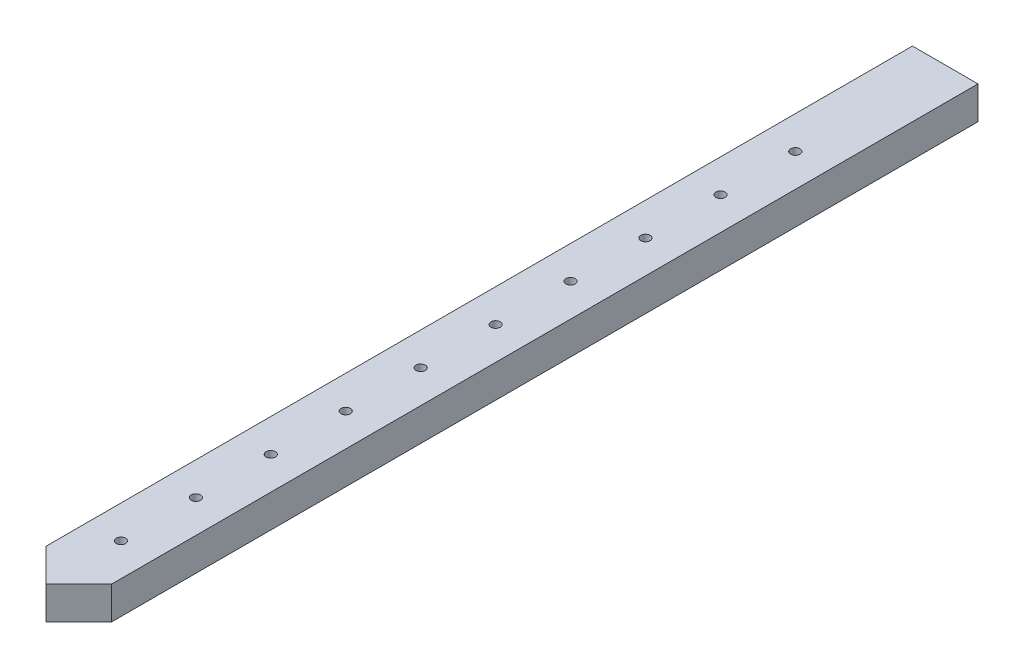
ISO-10303-21;
HEADER;
FILE_DESCRIPTION(('STEP AP214'),'2;1');
FILE_NAME('part.step','',(''),(''),'','','');
FILE_SCHEMA(('AUTOMOTIVE_DESIGN { 1 0 10303 214 1 1 1 1 }'));
ENDSEC;
DATA;
#1=APPLICATION_CONTEXT('core data for automotive mechanical design processes');
#2=APPLICATION_PROTOCOL_DEFINITION('international standard','automotive_design',2000,#1);
#3=PRODUCT_CONTEXT('',#1,'mechanical');
#4=PRODUCT('Part','Part','',(#3));
#5=PRODUCT_RELATED_PRODUCT_CATEGORY('part','',(#4));
#6=PRODUCT_DEFINITION_FORMATION('','',#4);
#7=PRODUCT_DEFINITION_CONTEXT('part definition',#1,'design');
#8=PRODUCT_DEFINITION('design','',#6,#7);
#9=PRODUCT_DEFINITION_SHAPE('','',#8);
#10=(LENGTH_UNIT() NAMED_UNIT(*) SI_UNIT(.MILLI.,.METRE.));
#11=(NAMED_UNIT(*) PLANE_ANGLE_UNIT() SI_UNIT($,.RADIAN.));
#12=(NAMED_UNIT(*) SI_UNIT($,.STERADIAN.) SOLID_ANGLE_UNIT());
#13=UNCERTAINTY_MEASURE_WITH_UNIT(LENGTH_MEASURE(1.E-05),#10,'distance_accuracy_value','');
#14=(GEOMETRIC_REPRESENTATION_CONTEXT(3) GLOBAL_UNCERTAINTY_ASSIGNED_CONTEXT((#13)) GLOBAL_UNIT_ASSIGNED_CONTEXT((#10,
#11,#12)) REPRESENTATION_CONTEXT('',''));
#15=CARTESIAN_POINT('',(0.,0.,0.));
#16=DIRECTION('',(0.,0.,1.));
#17=DIRECTION('',(1.,0.,0.));
#18=AXIS2_PLACEMENT_3D('',#15,#16,#17);
#19=CARTESIAN_POINT('',(0.,0.,203.200000000001));
#20=DIRECTION('',(0.,1.,0.));
#21=DIRECTION('',(0.,0.,1.));
#22=AXIS2_PLACEMENT_3D('',#19,#20,#21);
#23=PLANE('',#22);
#24=CARTESIAN_POINT('',(0.,0.,203.200000000001));
#25=DIRECTION('',(0.,1.,0.));
#26=DIRECTION('',(0.,0.,1.));
#27=AXIS2_PLACEMENT_3D('',#24,#25,#26);
#28=CIRCLE('',#27,6.35);
#29=CARTESIAN_POINT('',(0.,0.,209.55));
#30=VERTEX_POINT('',#29);
#31=EDGE_CURVE('E12',#30,#30,#28,.T.);
#32=ORIENTED_EDGE('',*,*,#31,.T.);
#33=EDGE_LOOP('',(#32));
#34=FACE_BOUND('',#33,.T.);
#35=ADVANCED_FACE('F50',(#34),#23,.T.);
#36=CARTESIAN_POINT('',(0.,0.,203.200000000001));
#37=DIRECTION('',(0.,1.,0.));
#38=DIRECTION('',(0.,0.,1.));
#39=AXIS2_PLACEMENT_3D('',#36,#37,#38);
#40=CYLINDRICAL_SURFACE('',#39,6.35);
#41=ORIENTED_EDGE('',*,*,#31,.F.);
#42=EDGE_LOOP('',(#41));
#43=FACE_BOUND('',#42,.T.);
#44=CARTESIAN_POINT('',(0.,22.225,203.200000000001));
#45=DIRECTION('',(0.,1.,0.));
#46=DIRECTION('',(0.,0.,1.));
#47=AXIS2_PLACEMENT_3D('',#44,#45,#46);
#48=CIRCLE('',#47,6.35);
#49=CARTESIAN_POINT('',(0.,22.225,209.55));
#50=VERTEX_POINT('',#49);
#51=EDGE_CURVE('E57',#50,#50,#48,.T.);
#52=ORIENTED_EDGE('',*,*,#51,.T.);
#53=EDGE_LOOP('',(#52));
#54=FACE_BOUND('',#53,.T.);
#55=ADVANCED_FACE('F181',(#43,#54),#40,.F.);
#56=CARTESIAN_POINT('',(0.,0.,304.800000000001));
#57=DIRECTION('',(0.,1.,0.));
#58=DIRECTION('',(0.,0.,1.));
#59=AXIS2_PLACEMENT_3D('',#56,#57,#58);
#60=PLANE('',#59);
#61=CARTESIAN_POINT('',(0.,0.,304.800000000001));
#62=DIRECTION('',(0.,1.,0.));
#63=DIRECTION('',(0.,0.,1.));
#64=AXIS2_PLACEMENT_3D('',#61,#62,#63);
#65=CIRCLE('',#64,6.35);
#66=CARTESIAN_POINT('',(0.,0.,311.150000000001));
#67=VERTEX_POINT('',#66);
#68=EDGE_CURVE('E176',#67,#67,#65,.T.);
#69=ORIENTED_EDGE('',*,*,#68,.T.);
#70=EDGE_LOOP('',(#69));
#71=FACE_BOUND('',#70,.T.);
#72=ADVANCED_FACE('F204',(#71),#60,.T.);
#73=CARTESIAN_POINT('',(0.,0.,304.800000000001));
#74=DIRECTION('',(0.,1.,0.));
#75=DIRECTION('',(0.,0.,1.));
#76=AXIS2_PLACEMENT_3D('',#73,#74,#75);
#77=CYLINDRICAL_SURFACE('',#76,6.35);
#78=ORIENTED_EDGE('',*,*,#68,.F.);
#79=EDGE_LOOP('',(#78));
#80=FACE_BOUND('',#79,.T.);
#81=CARTESIAN_POINT('',(0.,22.225,304.800000000001));
#82=DIRECTION('',(0.,1.,0.));
#83=DIRECTION('',(0.,0.,1.));
#84=AXIS2_PLACEMENT_3D('',#81,#82,#83);
#85=CIRCLE('',#84,6.35);
#86=CARTESIAN_POINT('',(0.,22.225,311.150000000001));
#87=VERTEX_POINT('',#86);
#88=EDGE_CURVE('E173',#87,#87,#85,.T.);
#89=ORIENTED_EDGE('',*,*,#88,.T.);
#90=EDGE_LOOP('',(#89));
#91=FACE_BOUND('',#90,.T.);
#92=ADVANCED_FACE('F210',(#80,#91),#77,.F.);
#93=CARTESIAN_POINT('',(0.,0.,406.400000000001));
#94=DIRECTION('',(0.,1.,0.));
#95=DIRECTION('',(0.,0.,1.));
#96=AXIS2_PLACEMENT_3D('',#93,#94,#95);
#97=PLANE('',#96);
#98=CARTESIAN_POINT('',(0.,0.,406.400000000001));
#99=DIRECTION('',(0.,1.,0.));
#100=DIRECTION('',(0.,0.,1.));
#101=AXIS2_PLACEMENT_3D('',#98,#99,#100);
#102=CIRCLE('',#101,6.35);
#103=CARTESIAN_POINT('',(0.,0.,412.750000000001));
#104=VERTEX_POINT('',#103);
#105=EDGE_CURVE('E170',#104,#104,#102,.T.);
#106=ORIENTED_EDGE('',*,*,#105,.T.);
#107=EDGE_LOOP('',(#106));
#108=FACE_BOUND('',#107,.T.);
#109=ADVANCED_FACE('F216',(#108),#97,.T.);
#110=CARTESIAN_POINT('',(0.,0.,406.400000000001));
#111=DIRECTION('',(0.,1.,0.));
#112=DIRECTION('',(0.,0.,1.));
#113=AXIS2_PLACEMENT_3D('',#110,#111,#112);
#114=CYLINDRICAL_SURFACE('',#113,6.35);
#115=ORIENTED_EDGE('',*,*,#105,.F.);
#116=EDGE_LOOP('',(#115));
#117=FACE_BOUND('',#116,.T.);
#118=CARTESIAN_POINT('',(0.,22.225,406.400000000001));
#119=DIRECTION('',(0.,1.,0.));
#120=DIRECTION('',(0.,0.,1.));
#121=AXIS2_PLACEMENT_3D('',#118,#119,#120);
#122=CIRCLE('',#121,6.35);
#123=CARTESIAN_POINT('',(0.,22.225,412.750000000001));
#124=VERTEX_POINT('',#123);
#125=EDGE_CURVE('E167',#124,#124,#122,.T.);
#126=ORIENTED_EDGE('',*,*,#125,.T.);
#127=EDGE_LOOP('',(#126));
#128=FACE_BOUND('',#127,.T.);
#129=ADVANCED_FACE('F220',(#117,#128),#114,.F.);
#130=CARTESIAN_POINT('',(0.,0.,508.000000000001));
#131=DIRECTION('',(0.,1.,0.));
#132=DIRECTION('',(0.,0.,1.));
#133=AXIS2_PLACEMENT_3D('',#130,#131,#132);
#134=PLANE('',#133);
#135=CARTESIAN_POINT('',(0.,0.,508.000000000001));
#136=DIRECTION('',(0.,1.,0.));
#137=DIRECTION('',(0.,0.,1.));
#138=AXIS2_PLACEMENT_3D('',#135,#136,#137);
#139=CIRCLE('',#138,6.35);
#140=CARTESIAN_POINT('',(0.,0.,514.35));
#141=VERTEX_POINT('',#140);
#142=EDGE_CURVE('E164',#141,#141,#139,.T.);
#143=ORIENTED_EDGE('',*,*,#142,.T.);
#144=EDGE_LOOP('',(#143));
#145=FACE_BOUND('',#144,.T.);
#146=ADVANCED_FACE('F224',(#145),#134,.T.);
#147=CARTESIAN_POINT('',(0.,0.,508.000000000001));
#148=DIRECTION('',(0.,1.,0.));
#149=DIRECTION('',(0.,0.,1.));
#150=AXIS2_PLACEMENT_3D('',#147,#148,#149);
#151=CYLINDRICAL_SURFACE('',#150,6.35);
#152=ORIENTED_EDGE('',*,*,#142,.F.);
#153=EDGE_LOOP('',(#152));
#154=FACE_BOUND('',#153,.T.);
#155=CARTESIAN_POINT('',(0.,22.225,508.000000000001));
#156=DIRECTION('',(0.,1.,0.));
#157=DIRECTION('',(0.,0.,1.));
#158=AXIS2_PLACEMENT_3D('',#155,#156,#157);
#159=CIRCLE('',#158,6.35);
#160=CARTESIAN_POINT('',(0.,22.225,514.35));
#161=VERTEX_POINT('',#160);
#162=EDGE_CURVE('E161',#161,#161,#159,.T.);
#163=ORIENTED_EDGE('',*,*,#162,.T.);
#164=EDGE_LOOP('',(#163));
#165=FACE_BOUND('',#164,.T.);
#166=ADVANCED_FACE('F228',(#154,#165),#151,.F.);
#167=CARTESIAN_POINT('',(0.,0.,609.6));
#168=DIRECTION('',(0.,1.,0.));
#169=DIRECTION('',(0.,0.,1.));
#170=AXIS2_PLACEMENT_3D('',#167,#168,#169);
#171=PLANE('',#170);
#172=CARTESIAN_POINT('',(0.,0.,609.6));
#173=DIRECTION('',(0.,1.,0.));
#174=DIRECTION('',(0.,0.,1.));
#175=AXIS2_PLACEMENT_3D('',#172,#173,#174);
#176=CIRCLE('',#175,6.35);
#177=CARTESIAN_POINT('',(0.,0.,615.95));
#178=VERTEX_POINT('',#177);
#179=EDGE_CURVE('E158',#178,#178,#176,.T.);
#180=ORIENTED_EDGE('',*,*,#179,.T.);
#181=EDGE_LOOP('',(#180));
#182=FACE_BOUND('',#181,.T.);
#183=ADVANCED_FACE('F232',(#182),#171,.T.);
#184=CARTESIAN_POINT('',(0.,0.,609.6));
#185=DIRECTION('',(0.,1.,0.));
#186=DIRECTION('',(0.,0.,1.));
#187=AXIS2_PLACEMENT_3D('',#184,#185,#186);
#188=CYLINDRICAL_SURFACE('',#187,6.35);
#189=ORIENTED_EDGE('',*,*,#179,.F.);
#190=EDGE_LOOP('',(#189));
#191=FACE_BOUND('',#190,.T.);
#192=CARTESIAN_POINT('',(0.,22.225,609.6));
#193=DIRECTION('',(0.,1.,0.));
#194=DIRECTION('',(0.,0.,1.));
#195=AXIS2_PLACEMENT_3D('',#192,#193,#194);
#196=CIRCLE('',#195,6.35);
#197=CARTESIAN_POINT('',(0.,22.225,615.95));
#198=VERTEX_POINT('',#197);
#199=EDGE_CURVE('E155',#198,#198,#196,.T.);
#200=ORIENTED_EDGE('',*,*,#199,.T.);
#201=EDGE_LOOP('',(#200));
#202=FACE_BOUND('',#201,.T.);
#203=ADVANCED_FACE('F236',(#191,#202),#188,.F.);
#204=CARTESIAN_POINT('',(0.,0.,711.200000000001));
#205=DIRECTION('',(0.,1.,0.));
#206=DIRECTION('',(0.,0.,1.));
#207=AXIS2_PLACEMENT_3D('',#204,#205,#206);
#208=PLANE('',#207);
#209=CARTESIAN_POINT('',(0.,0.,711.200000000001));
#210=DIRECTION('',(0.,1.,0.));
#211=DIRECTION('',(0.,0.,1.));
#212=AXIS2_PLACEMENT_3D('',#209,#210,#211);
#213=CIRCLE('',#212,6.35);
#214=CARTESIAN_POINT('',(0.,0.,717.55));
#215=VERTEX_POINT('',#214);
#216=EDGE_CURVE('E152',#215,#215,#213,.T.);
#217=ORIENTED_EDGE('',*,*,#216,.T.);
#218=EDGE_LOOP('',(#217));
#219=FACE_BOUND('',#218,.T.);
#220=ADVANCED_FACE('F240',(#219),#208,.T.);
#221=CARTESIAN_POINT('',(0.,0.,711.200000000001));
#222=DIRECTION('',(0.,1.,0.));
#223=DIRECTION('',(0.,0.,1.));
#224=AXIS2_PLACEMENT_3D('',#221,#222,#223);
#225=CYLINDRICAL_SURFACE('',#224,6.35);
#226=ORIENTED_EDGE('',*,*,#216,.F.);
#227=EDGE_LOOP('',(#226));
#228=FACE_BOUND('',#227,.T.);
#229=CARTESIAN_POINT('',(0.,22.225,711.200000000001));
#230=DIRECTION('',(0.,1.,0.));
#231=DIRECTION('',(0.,0.,1.));
#232=AXIS2_PLACEMENT_3D('',#229,#230,#231);
#233=CIRCLE('',#232,6.35);
#234=CARTESIAN_POINT('',(0.,22.225,717.55));
#235=VERTEX_POINT('',#234);
#236=EDGE_CURVE('E149',#235,#235,#233,.T.);
#237=ORIENTED_EDGE('',*,*,#236,.T.);
#238=EDGE_LOOP('',(#237));
#239=FACE_BOUND('',#238,.T.);
#240=ADVANCED_FACE('F244',(#228,#239),#225,.F.);
#241=CARTESIAN_POINT('',(0.,0.,812.800000000001));
#242=DIRECTION('',(0.,1.,0.));
#243=DIRECTION('',(0.,0.,1.));
#244=AXIS2_PLACEMENT_3D('',#241,#242,#243);
#245=PLANE('',#244);
#246=CARTESIAN_POINT('',(0.,0.,812.800000000001));
#247=DIRECTION('',(0.,1.,0.));
#248=DIRECTION('',(0.,0.,1.));
#249=AXIS2_PLACEMENT_3D('',#246,#247,#248);
#250=CIRCLE('',#249,6.35);
#251=CARTESIAN_POINT('',(0.,0.,819.150000000001));
#252=VERTEX_POINT('',#251);
#253=EDGE_CURVE('E146',#252,#252,#250,.T.);
#254=ORIENTED_EDGE('',*,*,#253,.T.);
#255=EDGE_LOOP('',(#254));
#256=FACE_BOUND('',#255,.T.);
#257=ADVANCED_FACE('F248',(#256),#245,.T.);
#258=CARTESIAN_POINT('',(0.,0.,812.800000000001));
#259=DIRECTION('',(0.,1.,0.));
#260=DIRECTION('',(0.,0.,1.));
#261=AXIS2_PLACEMENT_3D('',#258,#259,#260);
#262=CYLINDRICAL_SURFACE('',#261,6.35);
#263=ORIENTED_EDGE('',*,*,#253,.F.);
#264=EDGE_LOOP('',(#263));
#265=FACE_BOUND('',#264,.T.);
#266=CARTESIAN_POINT('',(0.,22.225,812.800000000001));
#267=DIRECTION('',(0.,1.,0.));
#268=DIRECTION('',(0.,0.,1.));
#269=AXIS2_PLACEMENT_3D('',#266,#267,#268);
#270=CIRCLE('',#269,6.35);
#271=CARTESIAN_POINT('',(0.,22.225,819.150000000001));
#272=VERTEX_POINT('',#271);
#273=EDGE_CURVE('E143',#272,#272,#270,.T.);
#274=ORIENTED_EDGE('',*,*,#273,.T.);
#275=EDGE_LOOP('',(#274));
#276=FACE_BOUND('',#275,.T.);
#277=ADVANCED_FACE('F252',(#265,#276),#262,.F.);
#278=CARTESIAN_POINT('',(0.,0.,914.4));
#279=DIRECTION('',(0.,1.,0.));
#280=DIRECTION('',(0.,0.,1.));
#281=AXIS2_PLACEMENT_3D('',#278,#279,#280);
#282=PLANE('',#281);
#283=CARTESIAN_POINT('',(0.,0.,914.4));
#284=DIRECTION('',(0.,1.,0.));
#285=DIRECTION('',(0.,0.,1.));
#286=AXIS2_PLACEMENT_3D('',#283,#284,#285);
#287=CIRCLE('',#286,6.35);
#288=CARTESIAN_POINT('',(0.,0.,920.75));
#289=VERTEX_POINT('',#288);
#290=EDGE_CURVE('E140',#289,#289,#287,.T.);
#291=ORIENTED_EDGE('',*,*,#290,.T.);
#292=EDGE_LOOP('',(#291));
#293=FACE_BOUND('',#292,.T.);
#294=ADVANCED_FACE('F256',(#293),#282,.T.);
#295=CARTESIAN_POINT('',(0.,0.,914.4));
#296=DIRECTION('',(0.,1.,0.));
#297=DIRECTION('',(0.,0.,1.));
#298=AXIS2_PLACEMENT_3D('',#295,#296,#297);
#299=CYLINDRICAL_SURFACE('',#298,6.35);
#300=ORIENTED_EDGE('',*,*,#290,.F.);
#301=EDGE_LOOP('',(#300));
#302=FACE_BOUND('',#301,.T.);
#303=CARTESIAN_POINT('',(0.,22.225,914.4));
#304=DIRECTION('',(0.,1.,0.));
#305=DIRECTION('',(0.,0.,1.));
#306=AXIS2_PLACEMENT_3D('',#303,#304,#305);
#307=CIRCLE('',#306,6.35);
#308=CARTESIAN_POINT('',(0.,22.225,920.75));
#309=VERTEX_POINT('',#308);
#310=EDGE_CURVE('E137',#309,#309,#307,.T.);
#311=ORIENTED_EDGE('',*,*,#310,.T.);
#312=EDGE_LOOP('',(#311));
#313=FACE_BOUND('',#312,.T.);
#314=ADVANCED_FACE('F194',(#302,#313),#299,.F.);
#315=CARTESIAN_POINT('',(44.45,-22.225,1219.2));
#316=DIRECTION('',(-1.,0.,0.));
#317=DIRECTION('',(0.,0.,1.));
#318=AXIS2_PLACEMENT_3D('',#315,#316,#317);
#319=PLANE('',#318);
#320=DIRECTION('',(0.,1.,0.));
#321=VECTOR('',#320,1.);
#322=CARTESIAN_POINT('',(44.45,-22.225,1174.75));
#323=LINE('',#322,#321);
#324=CARTESIAN_POINT('',(44.45,-22.225,1174.75));
#325=VERTEX_POINT('',#324);
#326=CARTESIAN_POINT('',(44.45,22.225,1174.75));
#327=VERTEX_POINT('',#326);
#328=EDGE_CURVE('E111',#325,#327,#323,.T.);
#329=ORIENTED_EDGE('',*,*,#328,.F.);
#330=DIRECTION('',(0.,0.,-1.));
#331=VECTOR('',#330,1.);
#332=CARTESIAN_POINT('',(44.45,-22.225,1219.2));
#333=LINE('',#332,#331);
#334=CARTESIAN_POINT('',(44.45,-22.225,0.));
#335=VERTEX_POINT('',#334);
#336=EDGE_CURVE('E64',#325,#335,#333,.T.);
#337=ORIENTED_EDGE('',*,*,#336,.T.);
#338=DIRECTION('',(0.,1.,0.));
#339=VECTOR('',#338,1.);
#340=CARTESIAN_POINT('',(44.45,-22.225,0.));
#341=LINE('',#340,#339);
#342=CARTESIAN_POINT('',(44.45,22.225,0.));
#343=VERTEX_POINT('',#342);
#344=EDGE_CURVE('E121',#335,#343,#341,.T.);
#345=ORIENTED_EDGE('',*,*,#344,.T.);
#346=DIRECTION('',(0.,0.,-1.));
#347=VECTOR('',#346,1.);
#348=CARTESIAN_POINT('',(44.45,22.225,1219.2));
#349=LINE('',#348,#347);
#350=EDGE_CURVE('E135',#327,#343,#349,.T.);
#351=ORIENTED_EDGE('',*,*,#350,.F.);
#352=EDGE_LOOP('',(#329,#337,#345,#351));
#353=FACE_BOUND('',#352,.T.);
#354=ADVANCED_FACE('F185',(#353),#319,.F.);
#355=CARTESIAN_POINT('',(-44.45,22.225,1219.2));
#356=DIRECTION('',(0.,-1.,0.));
#357=DIRECTION('',(0.,0.,-1.));
#358=AXIS2_PLACEMENT_3D('',#355,#356,#357);
#359=PLANE('',#358);
#360=CARTESIAN_POINT('',(0.,22.225,1016.));
#361=DIRECTION('',(0.,1.,0.));
#362=DIRECTION('',(0.,0.,1.));
#363=AXIS2_PLACEMENT_3D('',#360,#361,#362);
#364=CIRCLE('',#363,6.35);
#365=CARTESIAN_POINT('',(0.,22.225,1022.35));
#366=VERTEX_POINT('',#365);
#367=EDGE_CURVE('E479',#366,#366,#364,.T.);
#368=ORIENTED_EDGE('',*,*,#367,.F.);
#369=EDGE_LOOP('',(#368));
#370=FACE_BOUND('',#369,.T.);
#371=CARTESIAN_POINT('',(0.,22.225,1117.6));
#372=DIRECTION('',(0.,1.,0.));
#373=DIRECTION('',(0.,0.,1.));
#374=AXIS2_PLACEMENT_3D('',#371,#372,#373);
#375=CIRCLE('',#374,6.35);
#376=CARTESIAN_POINT('',(0.,22.225,1123.95));
#377=VERTEX_POINT('',#376);
#378=EDGE_CURVE('E472',#377,#377,#375,.T.);
#379=ORIENTED_EDGE('',*,*,#378,.F.);
#380=EDGE_LOOP('',(#379));
#381=FACE_BOUND('',#380,.T.);
#382=DIRECTION('',(0.70710678118655,0.,-0.707106781186545));
#383=VECTOR('',#382,1.);
#384=CARTESIAN_POINT('',(609.6,22.225,609.600000000005));
#385=LINE('',#384,#383);
#386=CARTESIAN_POINT('',(0.,22.225,1219.2));
#387=VERTEX_POINT('',#386);
#388=EDGE_CURVE('E103',#387,#327,#385,.T.);
#389=ORIENTED_EDGE('',*,*,#388,.T.);
#390=ORIENTED_EDGE('',*,*,#350,.T.);
#391=DIRECTION('',(-1.,0.,0.));
#392=VECTOR('',#391,1.);
#393=CARTESIAN_POINT('',(-44.45,22.225,0.));
#394=LINE('',#393,#392);
#395=CARTESIAN_POINT('',(-44.45,22.225,0.));
#396=VERTEX_POINT('',#395);
#397=EDGE_CURVE('E124',#343,#396,#394,.T.);
#398=ORIENTED_EDGE('',*,*,#397,.T.);
#399=DIRECTION('',(0.,0.,-1.));
#400=VECTOR('',#399,1.);
#401=CARTESIAN_POINT('',(-44.45,22.225,1219.2));
#402=LINE('',#401,#400);
#403=CARTESIAN_POINT('',(-44.45,22.225,1174.75));
#404=VERTEX_POINT('',#403);
#405=EDGE_CURVE('E133',#404,#396,#402,.T.);
#406=ORIENTED_EDGE('',*,*,#405,.F.);
#407=DIRECTION('',(-0.707106781186552,0.,-0.707106781186543));
#408=VECTOR('',#407,1.);
#409=CARTESIAN_POINT('',(-609.6,22.225,609.600000000008));
#410=LINE('',#409,#408);
#411=EDGE_CURVE('E115',#387,#404,#410,.T.);
#412=ORIENTED_EDGE('',*,*,#411,.F.);
#413=EDGE_LOOP('',(#389,#390,#398,#406,#412));
#414=FACE_BOUND('',#413,.T.);
#415=ORIENTED_EDGE('',*,*,#310,.F.);
#416=EDGE_LOOP('',(#415));
#417=FACE_BOUND('',#416,.T.);
#418=ORIENTED_EDGE('',*,*,#273,.F.);
#419=EDGE_LOOP('',(#418));
#420=FACE_BOUND('',#419,.T.);
#421=ORIENTED_EDGE('',*,*,#236,.F.);
#422=EDGE_LOOP('',(#421));
#423=FACE_BOUND('',#422,.T.);
#424=ORIENTED_EDGE('',*,*,#199,.F.);
#425=EDGE_LOOP('',(#424));
#426=FACE_BOUND('',#425,.T.);
#427=ORIENTED_EDGE('',*,*,#162,.F.);
#428=EDGE_LOOP('',(#427));
#429=FACE_BOUND('',#428,.T.);
#430=ORIENTED_EDGE('',*,*,#125,.F.);
#431=EDGE_LOOP('',(#430));
#432=FACE_BOUND('',#431,.T.);
#433=ORIENTED_EDGE('',*,*,#88,.F.);
#434=EDGE_LOOP('',(#433));
#435=FACE_BOUND('',#434,.T.);
#436=ORIENTED_EDGE('',*,*,#51,.F.);
#437=EDGE_LOOP('',(#436));
#438=FACE_BOUND('',#437,.T.);
#439=ADVANCED_FACE('F183',(#370,#381,#414,#417,#420,#423,#426,#429,#432,#435,#438),#359,.F.);
#440=CARTESIAN_POINT('',(-44.45,-22.225,1219.2));
#441=DIRECTION('',(0.,1.,0.));
#442=DIRECTION('',(0.,0.,1.));
#443=AXIS2_PLACEMENT_3D('',#440,#441,#442);
#444=PLANE('',#443);
#445=DIRECTION('',(0.70710678118655,0.,-0.707106781186545));
#446=VECTOR('',#445,1.);
#447=CARTESIAN_POINT('',(609.6,-22.225,609.600000000005));
#448=LINE('',#447,#446);
#449=CARTESIAN_POINT('',(0.,-22.225,1219.2));
#450=VERTEX_POINT('',#449);
#451=EDGE_CURVE('E101',#450,#325,#448,.T.);
#452=ORIENTED_EDGE('',*,*,#451,.F.);
#453=DIRECTION('',(-0.707106781186552,0.,-0.707106781186543));
#454=VECTOR('',#453,1.);
#455=CARTESIAN_POINT('',(-609.6,-22.225,609.600000000008));
#456=LINE('',#455,#454);
#457=CARTESIAN_POINT('',(-44.45,-22.225,1174.75));
#458=VERTEX_POINT('',#457);
#459=EDGE_CURVE('E108',#450,#458,#456,.T.);
#460=ORIENTED_EDGE('',*,*,#459,.T.);
#461=DIRECTION('',(0.,0.,-1.));
#462=VECTOR('',#461,1.);
#463=CARTESIAN_POINT('',(-44.45,-22.225,1219.2));
#464=LINE('',#463,#462);
#465=CARTESIAN_POINT('',(-44.45,-22.225,0.));
#466=VERTEX_POINT('',#465);
#467=EDGE_CURVE('E71',#458,#466,#464,.T.);
#468=ORIENTED_EDGE('',*,*,#467,.T.);
#469=DIRECTION('',(1.,0.,0.));
#470=VECTOR('',#469,1.);
#471=CARTESIAN_POINT('',(-44.45,-22.225,0.));
#472=LINE('',#471,#470);
#473=EDGE_CURVE('E129',#466,#335,#472,.T.);
#474=ORIENTED_EDGE('',*,*,#473,.T.);
#475=ORIENTED_EDGE('',*,*,#336,.F.);
#476=EDGE_LOOP('',(#452,#460,#468,#474,#475));
#477=FACE_BOUND('',#476,.T.);
#478=ADVANCED_FACE('F110',(#477),#444,.F.);
#479=CARTESIAN_POINT('',(-44.45,-22.225,1219.2));
#480=DIRECTION('',(1.,0.,0.));
#481=DIRECTION('',(0.,0.,-1.));
#482=AXIS2_PLACEMENT_3D('',#479,#480,#481);
#483=PLANE('',#482);
#484=ORIENTED_EDGE('',*,*,#467,.F.);
#485=DIRECTION('',(0.,1.,0.));
#486=VECTOR('',#485,1.);
#487=CARTESIAN_POINT('',(-44.45,-22.225,1174.75));
#488=LINE('',#487,#486);
#489=EDGE_CURVE('E107',#458,#404,#488,.T.);
#490=ORIENTED_EDGE('',*,*,#489,.T.);
#491=ORIENTED_EDGE('',*,*,#405,.T.);
#492=DIRECTION('',(0.,-1.,0.));
#493=VECTOR('',#492,1.);
#494=CARTESIAN_POINT('',(-44.45,-22.225,0.));
#495=LINE('',#494,#493);
#496=EDGE_CURVE('E127',#396,#466,#495,.T.);
#497=ORIENTED_EDGE('',*,*,#496,.T.);
#498=EDGE_LOOP('',(#484,#490,#491,#497));
#499=FACE_BOUND('',#498,.T.);
#500=ADVANCED_FACE('F192',(#499),#483,.F.);
#501=CARTESIAN_POINT('',(0.,0.,0.));
#502=DIRECTION('',(0.,0.,-1.));
#503=DIRECTION('',(-1.,0.,0.));
#504=AXIS2_PLACEMENT_3D('',#501,#502,#503);
#505=PLANE('',#504);
#506=ORIENTED_EDGE('',*,*,#344,.F.);
#507=ORIENTED_EDGE('',*,*,#473,.F.);
#508=ORIENTED_EDGE('',*,*,#496,.F.);
#509=ORIENTED_EDGE('',*,*,#397,.F.);
#510=EDGE_LOOP('',(#506,#507,#508,#509));
#511=FACE_BOUND('',#510,.T.);
#512=ADVANCED_FACE('F301',(#511),#505,.T.);
#513=CARTESIAN_POINT('',(-609.6,-22.225,609.600000000008));
#514=DIRECTION('',(0.707106781186543,0.,-0.707106781186552));
#515=DIRECTION('',(-0.707106781186552,0.,-0.707106781186543));
#516=AXIS2_PLACEMENT_3D('',#513,#514,#515);
#517=PLANE('',#516);
#518=ORIENTED_EDGE('',*,*,#411,.T.);
#519=ORIENTED_EDGE('',*,*,#489,.F.);
#520=ORIENTED_EDGE('',*,*,#459,.F.);
#521=DIRECTION('',(0.,1.,0.));
#522=VECTOR('',#521,1.);
#523=CARTESIAN_POINT('',(0.,-22.225,1219.2));
#524=LINE('',#523,#522);
#525=EDGE_CURVE('E98',#450,#387,#524,.T.);
#526=ORIENTED_EDGE('',*,*,#525,.T.);
#527=EDGE_LOOP('',(#518,#519,#520,#526));
#528=FACE_BOUND('',#527,.T.);
#529=ADVANCED_FACE('F113',(#528),#517,.F.);
#530=CARTESIAN_POINT('',(609.6,-22.225,609.600000000005));
#531=DIRECTION('',(0.707106781186545,0.,0.70710678118655));
#532=DIRECTION('',(0.70710678118655,0.,-0.707106781186545));
#533=AXIS2_PLACEMENT_3D('',#530,#531,#532);
#534=PLANE('',#533);
#535=ORIENTED_EDGE('',*,*,#388,.F.);
#536=ORIENTED_EDGE('',*,*,#525,.F.);
#537=ORIENTED_EDGE('',*,*,#451,.T.);
#538=ORIENTED_EDGE('',*,*,#328,.T.);
#539=EDGE_LOOP('',(#535,#536,#537,#538));
#540=FACE_BOUND('',#539,.T.);
#541=ADVANCED_FACE('F100',(#540),#534,.T.);
#542=CARTESIAN_POINT('',(0.,0.,1117.6));
#543=DIRECTION('',(0.,1.,0.));
#544=DIRECTION('',(0.,0.,1.));
#545=AXIS2_PLACEMENT_3D('',#542,#543,#544);
#546=CYLINDRICAL_SURFACE('',#545,6.35);
#547=CARTESIAN_POINT('',(0.,0.,1117.6));
#548=DIRECTION('',(0.,1.,0.));
#549=DIRECTION('',(0.,0.,1.));
#550=AXIS2_PLACEMENT_3D('',#547,#548,#549);
#551=CIRCLE('',#550,6.35);
#552=CARTESIAN_POINT('',(0.,0.,1123.95));
#553=VERTEX_POINT('',#552);
#554=EDGE_CURVE('E470',#553,#553,#551,.T.);
#555=ORIENTED_EDGE('',*,*,#554,.F.);
#556=EDGE_LOOP('',(#555));
#557=FACE_BOUND('',#556,.T.);
#558=ORIENTED_EDGE('',*,*,#378,.T.);
#559=EDGE_LOOP('',(#558));
#560=FACE_BOUND('',#559,.T.);
#561=ADVANCED_FACE('F330',(#557,#560),#546,.F.);
#562=CARTESIAN_POINT('',(0.,0.,1117.6));
#563=DIRECTION('',(0.,1.,0.));
#564=DIRECTION('',(0.,0.,1.));
#565=AXIS2_PLACEMENT_3D('',#562,#563,#564);
#566=PLANE('',#565);
#567=ORIENTED_EDGE('',*,*,#554,.T.);
#568=EDGE_LOOP('',(#567));
#569=FACE_BOUND('',#568,.T.);
#570=ADVANCED_FACE('F339',(#569),#566,.T.);
#571=CARTESIAN_POINT('',(0.,0.,1016.));
#572=DIRECTION('',(0.,1.,0.));
#573=DIRECTION('',(0.,0.,1.));
#574=AXIS2_PLACEMENT_3D('',#571,#572,#573);
#575=CYLINDRICAL_SURFACE('',#574,6.35);
#576=CARTESIAN_POINT('',(0.,0.,1016.));
#577=DIRECTION('',(0.,1.,0.));
#578=DIRECTION('',(0.,0.,1.));
#579=AXIS2_PLACEMENT_3D('',#576,#577,#578);
#580=CIRCLE('',#579,6.35);
#581=CARTESIAN_POINT('',(0.,0.,1022.35));
#582=VERTEX_POINT('',#581);
#583=EDGE_CURVE('E476',#582,#582,#580,.T.);
#584=ORIENTED_EDGE('',*,*,#583,.F.);
#585=EDGE_LOOP('',(#584));
#586=FACE_BOUND('',#585,.T.);
#587=ORIENTED_EDGE('',*,*,#367,.T.);
#588=EDGE_LOOP('',(#587));
#589=FACE_BOUND('',#588,.T.);
#590=ADVANCED_FACE('F348',(#586,#589),#575,.F.);
#591=CARTESIAN_POINT('',(0.,0.,1016.));
#592=DIRECTION('',(0.,1.,0.));
#593=DIRECTION('',(0.,0.,1.));
#594=AXIS2_PLACEMENT_3D('',#591,#592,#593);
#595=PLANE('',#594);
#596=ORIENTED_EDGE('',*,*,#583,.T.);
#597=EDGE_LOOP('',(#596));
#598=FACE_BOUND('',#597,.T.);
#599=ADVANCED_FACE('F446',(#598),#595,.T.);
#600=CLOSED_SHELL('',(#35,#55,#72,#92,#109,#129,#146,#166,#183,#203,#220,#240,#257,#277,#294,
#314,#354,#439,#478,#500,#512,#529,#541,#561,#570,#590,#599));
#601=MANIFOLD_SOLID_BREP('B2',#600);
#602=ADVANCED_BREP_SHAPE_REPRESENTATION('',(#18,#601),#14);
#603=SHAPE_DEFINITION_REPRESENTATION(#9,#602);
ENDSEC;
END-ISO-10303-21;
